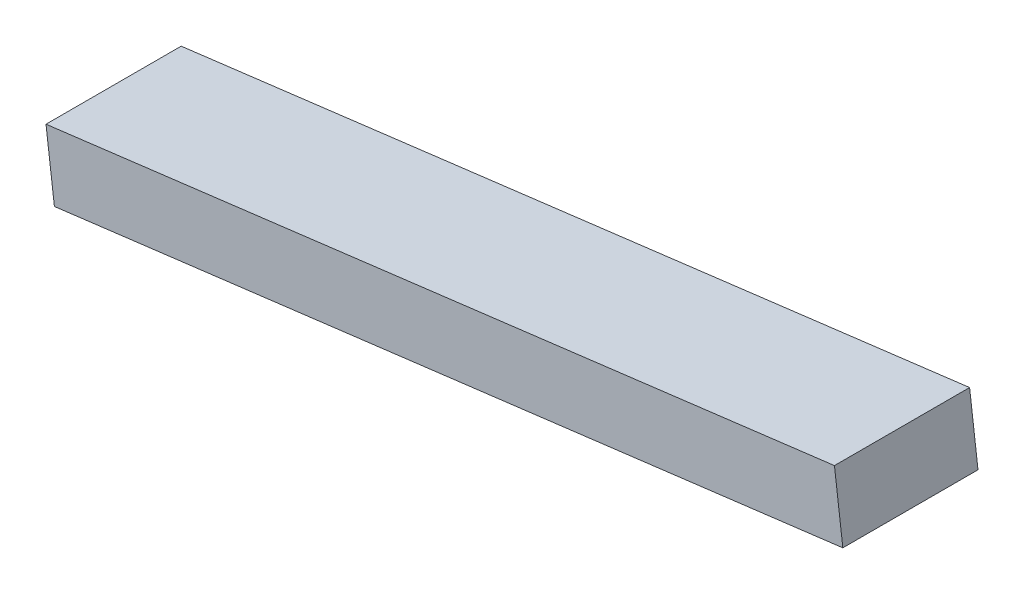
ISO-10303-21;
HEADER;
FILE_DESCRIPTION(('STEP AP214'),'2;1');
FILE_NAME('part.step','',(''),(''),'','','');
FILE_SCHEMA(('AUTOMOTIVE_DESIGN { 1 0 10303 214 1 1 1 1 }'));
ENDSEC;
DATA;
#1=APPLICATION_CONTEXT('core data for automotive mechanical design processes');
#2=APPLICATION_PROTOCOL_DEFINITION('international standard','automotive_design',2000,#1);
#3=PRODUCT_CONTEXT('',#1,'mechanical');
#4=PRODUCT('Part','Part','',(#3));
#5=PRODUCT_RELATED_PRODUCT_CATEGORY('part','',(#4));
#6=PRODUCT_DEFINITION_FORMATION('','',#4);
#7=PRODUCT_DEFINITION_CONTEXT('part definition',#1,'design');
#8=PRODUCT_DEFINITION('design','',#6,#7);
#9=PRODUCT_DEFINITION_SHAPE('','',#8);
#10=(LENGTH_UNIT() NAMED_UNIT(*) SI_UNIT(.MILLI.,.METRE.));
#11=(NAMED_UNIT(*) PLANE_ANGLE_UNIT() SI_UNIT($,.RADIAN.));
#12=(NAMED_UNIT(*) SI_UNIT($,.STERADIAN.) SOLID_ANGLE_UNIT());
#13=UNCERTAINTY_MEASURE_WITH_UNIT(LENGTH_MEASURE(1.E-05),#10,'distance_accuracy_value','');
#14=(GEOMETRIC_REPRESENTATION_CONTEXT(3) GLOBAL_UNCERTAINTY_ASSIGNED_CONTEXT((#13)) GLOBAL_UNIT_ASSIGNED_CONTEXT((#10,
#11,#12)) REPRESENTATION_CONTEXT('',''));
#15=CARTESIAN_POINT('',(0.,0.,0.));
#16=DIRECTION('',(0.,0.,1.));
#17=DIRECTION('',(1.,0.,0.));
#18=AXIS2_PLACEMENT_3D('',#15,#16,#17);
#19=CARTESIAN_POINT('',(368.571015472579,25.8277068433039,-636.696489798407));
#20=DIRECTION('',(0.124068164170064,-0.992273697444143,0.));
#21=DIRECTION('',(0.992273697444143,0.124068164170064,0.));
#22=AXIS2_PLACEMENT_3D('',#19,#20,#21);
#23=PLANE('',#22);
#24=DIRECTION('',(-0.992273697444143,-0.124068164170064,0.));
#25=VECTOR('',#24,1.);
#26=CARTESIAN_POINT('',(368.571015472579,25.8277068433039,-636.696489798407));
#27=LINE('',#26,#25);
#28=CARTESIAN_POINT('',(367.562865395976,25.7016535885072,-636.696489798407));
#29=VERTEX_POINT('',#28);
#30=CARTESIAN_POINT('',(293.480518874116,16.4388254453726,-636.696489798407));
#31=VERTEX_POINT('',#30);
#32=EDGE_CURVE('E56',#29,#31,#27,.T.);
#33=ORIENTED_EDGE('',*,*,#32,.F.);
#34=DIRECTION('',(0.,0.,-1.));
#35=VECTOR('',#34,1.);
#36=CARTESIAN_POINT('',(367.562865395976,25.7016535885072,-636.696489798407));
#37=LINE('',#36,#35);
#38=CARTESIAN_POINT('',(367.562865395976,25.7016535885072,-649.396489798407));
#39=VERTEX_POINT('',#38);
#40=EDGE_CURVE('E74',#29,#39,#37,.T.);
#41=ORIENTED_EDGE('',*,*,#40,.T.);
#42=DIRECTION('',(-0.992273697444143,-0.124068164170064,0.));
#43=VECTOR('',#42,1.);
#44=CARTESIAN_POINT('',(368.571015472579,25.8277068433039,-649.396489798407));
#45=LINE('',#44,#43);
#46=CARTESIAN_POINT('',(293.480518874116,16.4388254453726,-649.396489798407));
#47=VERTEX_POINT('',#46);
#48=EDGE_CURVE('E70',#39,#47,#45,.T.);
#49=ORIENTED_EDGE('',*,*,#48,.T.);
#50=DIRECTION('',(0.,0.,-1.));
#51=VECTOR('',#50,1.);
#52=CARTESIAN_POINT('',(293.480518874116,16.4388254453726,-636.696489798407));
#53=LINE('',#52,#51);
#54=EDGE_CURVE('E41',#31,#47,#53,.T.);
#55=ORIENTED_EDGE('',*,*,#54,.F.);
#56=EDGE_LOOP('',(#33,#41,#49,#55));
#57=FACE_BOUND('',#56,.T.);
#58=ADVANCED_FACE('F33',(#57),#23,.F.);
#59=CARTESIAN_POINT('',(293.480518874116,16.4388254453726,-636.696489798407));
#60=DIRECTION('',(0.992273697444144,0.124068164170055,0.));
#61=DIRECTION('',(-0.124068164170055,0.992273697444144,0.));
#62=AXIS2_PLACEMENT_3D('',#59,#60,#61);
#63=PLANE('',#62);
#64=DIRECTION('',(0.124068164170055,-0.992273697444144,0.));
#65=VECTOR('',#64,1.);
#66=CARTESIAN_POINT('',(293.480518874116,16.4388254453726,-649.396489798407));
#67=LINE('',#66,#65);
#68=CARTESIAN_POINT('',(294.268351716596,10.1378874666023,-649.396489798407));
#69=VERTEX_POINT('',#68);
#70=EDGE_CURVE('E78',#47,#69,#67,.T.);
#71=ORIENTED_EDGE('',*,*,#70,.T.);
#72=DIRECTION('',(0.,0.,-1.));
#73=VECTOR('',#72,1.);
#74=CARTESIAN_POINT('',(294.268351716596,10.1378874666023,-636.696489798407));
#75=LINE('',#74,#73);
#76=CARTESIAN_POINT('',(294.268351716596,10.1378874666023,-636.696489798407));
#77=VERTEX_POINT('',#76);
#78=EDGE_CURVE('E85',#77,#69,#75,.T.);
#79=ORIENTED_EDGE('',*,*,#78,.F.);
#80=DIRECTION('',(0.124068164170055,-0.992273697444144,0.));
#81=VECTOR('',#80,1.);
#82=CARTESIAN_POINT('',(293.480518874116,16.4388254453726,-636.696489798407));
#83=LINE('',#82,#81);
#84=EDGE_CURVE('E84',#31,#77,#83,.T.);
#85=ORIENTED_EDGE('',*,*,#84,.F.);
#86=ORIENTED_EDGE('',*,*,#54,.T.);
#87=EDGE_LOOP('',(#71,#79,#85,#86));
#88=FACE_BOUND('',#87,.T.);
#89=ADVANCED_FACE('F82',(#88),#63,.F.);
#90=CARTESIAN_POINT('',(369.358848315059,19.5267688645336,-636.696489798407));
#91=DIRECTION('',(0.124068164170064,-0.992273697444143,0.));
#92=DIRECTION('',(0.992273697444143,0.124068164170064,0.));
#93=AXIS2_PLACEMENT_3D('',#90,#91,#92);
#94=PLANE('',#93);
#95=DIRECTION('',(0.,0.,-1.));
#96=VECTOR('',#95,1.);
#97=CARTESIAN_POINT('',(368.350698238456,19.4007156097369,-649.396489798407));
#98=LINE('',#97,#96);
#99=CARTESIAN_POINT('',(368.350698238456,19.4007156097369,-636.696489798407));
#100=VERTEX_POINT('',#99);
#101=CARTESIAN_POINT('',(368.350698238456,19.4007156097369,-649.396489798407));
#102=VERTEX_POINT('',#101);
#103=EDGE_CURVE('E47',#100,#102,#98,.T.);
#104=ORIENTED_EDGE('',*,*,#103,.F.);
#105=DIRECTION('',(-0.992273697444143,-0.124068164170064,0.));
#106=VECTOR('',#105,1.);
#107=CARTESIAN_POINT('',(369.358848315059,19.5267688645336,-636.696489798407));
#108=LINE('',#107,#106);
#109=EDGE_CURVE('E77',#100,#77,#108,.T.);
#110=ORIENTED_EDGE('',*,*,#109,.T.);
#111=ORIENTED_EDGE('',*,*,#78,.T.);
#112=DIRECTION('',(-0.992273697444143,-0.124068164170064,0.));
#113=VECTOR('',#112,1.);
#114=CARTESIAN_POINT('',(369.358848315059,19.5267688645336,-649.396489798407));
#115=LINE('',#114,#113);
#116=EDGE_CURVE('E89',#102,#69,#115,.T.);
#117=ORIENTED_EDGE('',*,*,#116,.F.);
#118=EDGE_LOOP('',(#104,#110,#111,#117));
#119=FACE_BOUND('',#118,.T.);
#120=ADVANCED_FACE('F35',(#119),#94,.T.);
#121=CARTESIAN_POINT('',(0.,0.,-636.696489798407));
#122=DIRECTION('',(0.,0.,-1.));
#123=DIRECTION('',(-1.,0.,0.));
#124=AXIS2_PLACEMENT_3D('',#121,#122,#123);
#125=PLANE('',#124);
#126=ORIENTED_EDGE('',*,*,#109,.F.);
#127=DIRECTION('',(0.124068164170064,-0.992273697444143,0.));
#128=VECTOR('',#127,1.);
#129=CARTESIAN_POINT('',(366.407004187999,34.9460127860834,-636.696489798407));
#130=LINE('',#129,#128);
#131=EDGE_CURVE('E99',#29,#100,#130,.T.);
#132=ORIENTED_EDGE('',*,*,#131,.F.);
#133=ORIENTED_EDGE('',*,*,#32,.T.);
#134=ORIENTED_EDGE('',*,*,#84,.T.);
#135=EDGE_LOOP('',(#126,#132,#133,#134));
#136=FACE_BOUND('',#135,.T.);
#137=ADVANCED_FACE('F106',(#136),#125,.F.);
#138=CARTESIAN_POINT('',(0.,0.,-649.396489798407));
#139=DIRECTION('',(0.,0.,-1.));
#140=DIRECTION('',(-1.,0.,0.));
#141=AXIS2_PLACEMENT_3D('',#138,#139,#140);
#142=PLANE('',#141);
#143=DIRECTION('',(-0.124068164170064,0.992273697444143,0.));
#144=VECTOR('',#143,1.);
#145=CARTESIAN_POINT('',(365.06912320032,45.6461317349273,-649.396489798407));
#146=LINE('',#145,#144);
#147=EDGE_CURVE('E11',#102,#39,#146,.T.);
#148=ORIENTED_EDGE('',*,*,#147,.F.);
#149=ORIENTED_EDGE('',*,*,#116,.T.);
#150=ORIENTED_EDGE('',*,*,#70,.F.);
#151=ORIENTED_EDGE('',*,*,#48,.F.);
#152=EDGE_LOOP('',(#148,#149,#150,#151));
#153=FACE_BOUND('',#152,.T.);
#154=ADVANCED_FACE('F87',(#153),#142,.T.);
#155=CARTESIAN_POINT('',(366.407004187999,34.9460127860834,-649.396489798407));
#156=DIRECTION('',(-0.992273697444143,-0.124068164170064,0.));
#157=DIRECTION('',(0.124068164170064,-0.992273697444143,0.));
#158=AXIS2_PLACEMENT_3D('',#155,#156,#157);
#159=PLANE('',#158);
#160=ORIENTED_EDGE('',*,*,#131,.T.);
#161=ORIENTED_EDGE('',*,*,#103,.T.);
#162=ORIENTED_EDGE('',*,*,#147,.T.);
#163=ORIENTED_EDGE('',*,*,#40,.F.);
#164=EDGE_LOOP('',(#160,#161,#162,#163));
#165=FACE_BOUND('',#164,.T.);
#166=ADVANCED_FACE('F102',(#165),#159,.F.);
#167=CLOSED_SHELL('',(#58,#89,#120,#137,#154,#166));
#168=MANIFOLD_SOLID_BREP('B2',#167);
#169=ADVANCED_BREP_SHAPE_REPRESENTATION('',(#18,#168),#14);
#170=SHAPE_DEFINITION_REPRESENTATION(#9,#169);
ENDSEC;
END-ISO-10303-21;
